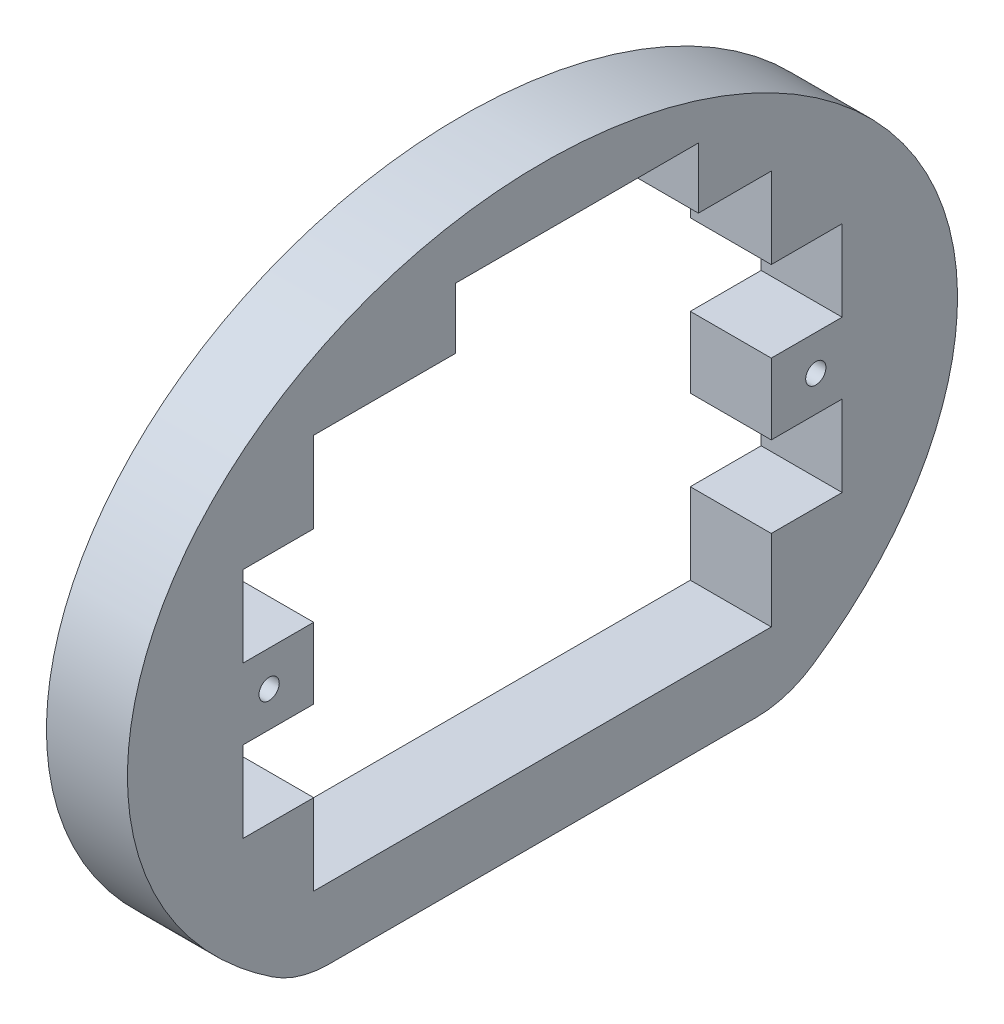
ISO-10303-21;
HEADER;
FILE_DESCRIPTION(('STEP AP214'),'2;1');
FILE_NAME('part.step','',(''),(''),'','','');
FILE_SCHEMA(('AUTOMOTIVE_DESIGN { 1 0 10303 214 1 1 1 1 }'));
ENDSEC;
DATA;
#1=APPLICATION_CONTEXT('core data for automotive mechanical design processes');
#2=APPLICATION_PROTOCOL_DEFINITION('international standard','automotive_design',2000,#1);
#3=PRODUCT_CONTEXT('',#1,'mechanical');
#4=PRODUCT('Part','Part','',(#3));
#5=PRODUCT_RELATED_PRODUCT_CATEGORY('part','',(#4));
#6=PRODUCT_DEFINITION_FORMATION('','',#4);
#7=PRODUCT_DEFINITION_CONTEXT('part definition',#1,'design');
#8=PRODUCT_DEFINITION('design','',#6,#7);
#9=PRODUCT_DEFINITION_SHAPE('','',#8);
#10=(LENGTH_UNIT() NAMED_UNIT(*) SI_UNIT(.MILLI.,.METRE.));
#11=(NAMED_UNIT(*) PLANE_ANGLE_UNIT() SI_UNIT($,.RADIAN.));
#12=(NAMED_UNIT(*) SI_UNIT($,.STERADIAN.) SOLID_ANGLE_UNIT());
#13=UNCERTAINTY_MEASURE_WITH_UNIT(LENGTH_MEASURE(1.E-05),#10,'distance_accuracy_value','');
#14=(GEOMETRIC_REPRESENTATION_CONTEXT(3) GLOBAL_UNCERTAINTY_ASSIGNED_CONTEXT((#13)) GLOBAL_UNIT_ASSIGNED_CONTEXT((#10,
#11,#12)) REPRESENTATION_CONTEXT('',''));
#15=CARTESIAN_POINT('',(0.,0.,0.));
#16=DIRECTION('',(0.,0.,1.));
#17=DIRECTION('',(1.,0.,0.));
#18=AXIS2_PLACEMENT_3D('',#15,#16,#17);
#19=CARTESIAN_POINT('',(4.,-3.50000000000002,0.));
#20=DIRECTION('',(0.,1.,0.));
#21=DIRECTION('',(0.,0.,1.));
#22=AXIS2_PLACEMENT_3D('',#19,#20,#21);
#23=PLANE('',#22);
#24=DIRECTION('',(0.,0.,-1.));
#25=VECTOR('',#24,1.);
#26=CARTESIAN_POINT('',(0.,-3.50000000000002,0.));
#27=LINE('',#26,#25);
#28=CARTESIAN_POINT('',(0.,-3.50000000000002,-0.7504563663472));
#29=VERTEX_POINT('',#28);
#30=CARTESIAN_POINT('',(0.,-3.50000000000002,-21.8495436336528));
#31=VERTEX_POINT('',#30);
#32=EDGE_CURVE('E467',#29,#31,#27,.T.);
#33=ORIENTED_EDGE('',*,*,#32,.T.);
#34=DIRECTION('',(-1.,0.,0.));
#35=VECTOR('',#34,1.);
#36=CARTESIAN_POINT('',(4.,-3.50000000000002,-21.8495436336528));
#37=LINE('',#36,#35);
#38=CARTESIAN_POINT('',(4.,-3.50000000000002,-21.8495436336528));
#39=VERTEX_POINT('',#38);
#40=EDGE_CURVE('E53',#31,#39,#37,.F.);
#41=ORIENTED_EDGE('',*,*,#40,.T.);
#42=DIRECTION('',(0.,0.,-1.));
#43=VECTOR('',#42,1.);
#44=CARTESIAN_POINT('',(4.,-3.50000000000002,0.));
#45=LINE('',#44,#43);
#46=CARTESIAN_POINT('',(4.,-3.50000000000002,-0.7504563663472));
#47=VERTEX_POINT('',#46);
#48=EDGE_CURVE('E321',#47,#39,#45,.T.);
#49=ORIENTED_EDGE('',*,*,#48,.F.);
#50=DIRECTION('',(-1.,0.,0.));
#51=VECTOR('',#50,1.);
#52=CARTESIAN_POINT('',(4.,-3.50000000000002,-0.7504563663472));
#53=LINE('',#52,#51);
#54=EDGE_CURVE('E462',#47,#29,#53,.T.);
#55=ORIENTED_EDGE('',*,*,#54,.T.);
#56=EDGE_LOOP('',(#33,#41,#49,#55));
#57=FACE_BOUND('',#56,.T.);
#58=ADVANCED_FACE('F38',(#57),#23,.F.);
#59=CARTESIAN_POINT('',(4.,15.5,0.));
#60=DIRECTION('',(0.,-1.,0.));
#61=DIRECTION('',(0.,0.,-1.));
#62=AXIS2_PLACEMENT_3D('',#59,#60,#61);
#63=PLANE('',#62);
#64=DIRECTION('',(0.,0.,1.));
#65=VECTOR('',#64,1.);
#66=CARTESIAN_POINT('',(0.,15.5,0.));
#67=LINE('',#66,#65);
#68=CARTESIAN_POINT('',(0.,15.5,0.));
#69=VERTEX_POINT('',#68);
#70=CARTESIAN_POINT('',(0.,15.5,3.5));
#71=VERTEX_POINT('',#70);
#72=EDGE_CURVE('E229',#69,#71,#67,.T.);
#73=ORIENTED_EDGE('',*,*,#72,.F.);
#74=DIRECTION('',(-1.,0.,0.));
#75=VECTOR('',#74,1.);
#76=CARTESIAN_POINT('',(4.,15.5,0.));
#77=LINE('',#76,#75);
#78=CARTESIAN_POINT('',(4.,15.5,0.));
#79=VERTEX_POINT('',#78);
#80=EDGE_CURVE('E223',#79,#69,#77,.T.);
#81=ORIENTED_EDGE('',*,*,#80,.F.);
#82=DIRECTION('',(0.,0.,1.));
#83=VECTOR('',#82,1.);
#84=CARTESIAN_POINT('',(4.,15.5,0.));
#85=LINE('',#84,#83);
#86=CARTESIAN_POINT('',(4.,15.5,3.5));
#87=VERTEX_POINT('',#86);
#88=EDGE_CURVE('E226',#79,#87,#85,.T.);
#89=ORIENTED_EDGE('',*,*,#88,.T.);
#90=DIRECTION('',(-1.,0.,0.));
#91=VECTOR('',#90,1.);
#92=CARTESIAN_POINT('',(4.,15.5,3.5));
#93=LINE('',#92,#91);
#94=EDGE_CURVE('E326',#87,#71,#93,.T.);
#95=ORIENTED_EDGE('',*,*,#94,.T.);
#96=EDGE_LOOP('',(#73,#81,#89,#95));
#97=FACE_BOUND('',#96,.T.);
#98=ADVANCED_FACE('F225',(#97),#63,.T.);
#99=CARTESIAN_POINT('',(4.,0.,0.));
#100=DIRECTION('',(0.,0.,-1.));
#101=DIRECTION('',(-1.,0.,0.));
#102=AXIS2_PLACEMENT_3D('',#99,#100,#101);
#103=PLANE('',#102);
#104=DIRECTION('',(0.,-1.,0.));
#105=VECTOR('',#104,1.);
#106=CARTESIAN_POINT('',(0.,0.,0.));
#107=LINE('',#106,#105);
#108=CARTESIAN_POINT('',(0.,19.5,0.));
#109=VERTEX_POINT('',#108);
#110=EDGE_CURVE('E523',#109,#69,#107,.T.);
#111=ORIENTED_EDGE('',*,*,#110,.F.);
#112=DIRECTION('',(-1.,0.,0.));
#113=VECTOR('',#112,1.);
#114=CARTESIAN_POINT('',(4.,19.5,0.));
#115=LINE('',#114,#113);
#116=CARTESIAN_POINT('',(4.,19.5,0.));
#117=VERTEX_POINT('',#116);
#118=EDGE_CURVE('E235',#117,#109,#115,.T.);
#119=ORIENTED_EDGE('',*,*,#118,.F.);
#120=DIRECTION('',(0.,-1.,0.));
#121=VECTOR('',#120,1.);
#122=CARTESIAN_POINT('',(4.,0.,0.));
#123=LINE('',#122,#121);
#124=EDGE_CURVE('E242',#117,#79,#123,.T.);
#125=ORIENTED_EDGE('',*,*,#124,.T.);
#126=ORIENTED_EDGE('',*,*,#80,.T.);
#127=EDGE_LOOP('',(#111,#119,#125,#126));
#128=FACE_BOUND('',#127,.T.);
#129=ADVANCED_FACE('F249',(#128),#103,.T.);
#130=CARTESIAN_POINT('',(4.,19.5,0.));
#131=DIRECTION('',(0.,-1.,0.));
#132=DIRECTION('',(0.,0.,-1.));
#133=AXIS2_PLACEMENT_3D('',#130,#131,#132);
#134=PLANE('',#133);
#135=DIRECTION('',(0.,0.,1.));
#136=VECTOR('',#135,1.);
#137=CARTESIAN_POINT('',(0.,19.5,0.));
#138=LINE('',#137,#136);
#139=CARTESIAN_POINT('',(0.,19.5,-7.));
#140=VERTEX_POINT('',#139);
#141=EDGE_CURVE('E521',#140,#109,#138,.T.);
#142=ORIENTED_EDGE('',*,*,#141,.F.);
#143=DIRECTION('',(-1.,0.,0.));
#144=VECTOR('',#143,1.);
#145=CARTESIAN_POINT('',(4.,19.5,-7.));
#146=LINE('',#145,#144);
#147=CARTESIAN_POINT('',(4.,19.5,-7.));
#148=VERTEX_POINT('',#147);
#149=EDGE_CURVE('E518',#148,#140,#146,.T.);
#150=ORIENTED_EDGE('',*,*,#149,.F.);
#151=DIRECTION('',(0.,0.,1.));
#152=VECTOR('',#151,1.);
#153=CARTESIAN_POINT('',(4.,19.5,0.));
#154=LINE('',#153,#152);
#155=EDGE_CURVE('E250',#148,#117,#154,.T.);
#156=ORIENTED_EDGE('',*,*,#155,.T.);
#157=ORIENTED_EDGE('',*,*,#118,.T.);
#158=EDGE_LOOP('',(#142,#150,#156,#157));
#159=FACE_BOUND('',#158,.T.);
#160=ADVANCED_FACE('F429',(#159),#134,.T.);
#161=CARTESIAN_POINT('',(4.,0.,-7.));
#162=DIRECTION('',(0.,0.,-1.));
#163=DIRECTION('',(-1.,0.,0.));
#164=AXIS2_PLACEMENT_3D('',#161,#162,#163);
#165=PLANE('',#164);
#166=DIRECTION('',(0.,-1.,0.));
#167=VECTOR('',#166,1.);
#168=CARTESIAN_POINT('',(0.,0.,-7.));
#169=LINE('',#168,#167);
#170=CARTESIAN_POINT('',(0.,22.5,-7.));
#171=VERTEX_POINT('',#170);
#172=EDGE_CURVE('E527',#171,#140,#169,.T.);
#173=ORIENTED_EDGE('',*,*,#172,.F.);
#174=DIRECTION('',(-1.,0.,0.));
#175=VECTOR('',#174,1.);
#176=CARTESIAN_POINT('',(4.,22.5,-7.));
#177=LINE('',#176,#175);
#178=CARTESIAN_POINT('',(4.,22.5,-7.));
#179=VERTEX_POINT('',#178);
#180=EDGE_CURVE('E516',#179,#171,#177,.T.);
#181=ORIENTED_EDGE('',*,*,#180,.F.);
#182=DIRECTION('',(0.,-1.,0.));
#183=VECTOR('',#182,1.);
#184=CARTESIAN_POINT('',(4.,0.,-7.));
#185=LINE('',#184,#183);
#186=EDGE_CURVE('E252',#179,#148,#185,.T.);
#187=ORIENTED_EDGE('',*,*,#186,.T.);
#188=ORIENTED_EDGE('',*,*,#149,.T.);
#189=EDGE_LOOP('',(#173,#181,#187,#188));
#190=FACE_BOUND('',#189,.T.);
#191=ADVANCED_FACE('F425',(#190),#165,.T.);
#192=CARTESIAN_POINT('',(4.,22.5,0.));
#193=DIRECTION('',(0.,-1.,0.));
#194=DIRECTION('',(0.,0.,-1.));
#195=AXIS2_PLACEMENT_3D('',#192,#193,#194);
#196=PLANE('',#195);
#197=DIRECTION('',(0.,0.,1.));
#198=VECTOR('',#197,1.);
#199=CARTESIAN_POINT('',(0.,22.5,0.));
#200=LINE('',#199,#198);
#201=CARTESIAN_POINT('',(0.,22.5,-19.));
#202=VERTEX_POINT('',#201);
#203=EDGE_CURVE('E529',#202,#171,#200,.T.);
#204=ORIENTED_EDGE('',*,*,#203,.F.);
#205=DIRECTION('',(-1.,0.,0.));
#206=VECTOR('',#205,1.);
#207=CARTESIAN_POINT('',(4.,22.5,-19.));
#208=LINE('',#207,#206);
#209=CARTESIAN_POINT('',(4.,22.5,-19.));
#210=VERTEX_POINT('',#209);
#211=EDGE_CURVE('E514',#210,#202,#208,.T.);
#212=ORIENTED_EDGE('',*,*,#211,.F.);
#213=DIRECTION('',(0.,0.,1.));
#214=VECTOR('',#213,1.);
#215=CARTESIAN_POINT('',(4.,22.5,0.));
#216=LINE('',#215,#214);
#217=EDGE_CURVE('E257',#210,#179,#216,.T.);
#218=ORIENTED_EDGE('',*,*,#217,.T.);
#219=ORIENTED_EDGE('',*,*,#180,.T.);
#220=EDGE_LOOP('',(#204,#212,#218,#219));
#221=FACE_BOUND('',#220,.T.);
#222=ADVANCED_FACE('F421',(#221),#196,.T.);
#223=CARTESIAN_POINT('',(4.,0.,-19.));
#224=DIRECTION('',(0.,0.,1.));
#225=DIRECTION('',(1.,0.,0.));
#226=AXIS2_PLACEMENT_3D('',#223,#224,#225);
#227=PLANE('',#226);
#228=DIRECTION('',(0.,1.,0.));
#229=VECTOR('',#228,1.);
#230=CARTESIAN_POINT('',(0.,0.,-19.));
#231=LINE('',#230,#229);
#232=CARTESIAN_POINT('',(0.,19.5,-19.));
#233=VERTEX_POINT('',#232);
#234=EDGE_CURVE('E533',#233,#202,#231,.T.);
#235=ORIENTED_EDGE('',*,*,#234,.F.);
#236=DIRECTION('',(-1.,0.,0.));
#237=VECTOR('',#236,1.);
#238=CARTESIAN_POINT('',(4.,19.5,-19.));
#239=LINE('',#238,#237);
#240=CARTESIAN_POINT('',(4.,19.5,-19.));
#241=VERTEX_POINT('',#240);
#242=EDGE_CURVE('E512',#241,#233,#239,.T.);
#243=ORIENTED_EDGE('',*,*,#242,.F.);
#244=DIRECTION('',(0.,1.,0.));
#245=VECTOR('',#244,1.);
#246=CARTESIAN_POINT('',(4.,0.,-19.));
#247=LINE('',#246,#245);
#248=EDGE_CURVE('E260',#241,#210,#247,.T.);
#249=ORIENTED_EDGE('',*,*,#248,.T.);
#250=ORIENTED_EDGE('',*,*,#211,.T.);
#251=EDGE_LOOP('',(#235,#243,#249,#250));
#252=FACE_BOUND('',#251,.T.);
#253=ADVANCED_FACE('F417',(#252),#227,.T.);
#254=CARTESIAN_POINT('',(4.,19.5,0.));
#255=DIRECTION('',(0.,-1.,0.));
#256=DIRECTION('',(0.,0.,-1.));
#257=AXIS2_PLACEMENT_3D('',#254,#255,#256);
#258=PLANE('',#257);
#259=DIRECTION('',(0.,0.,1.));
#260=VECTOR('',#259,1.);
#261=CARTESIAN_POINT('',(0.,19.5,0.));
#262=LINE('',#261,#260);
#263=CARTESIAN_POINT('',(0.,19.5,-22.6));
#264=VERTEX_POINT('',#263);
#265=EDGE_CURVE('E536',#264,#233,#262,.T.);
#266=ORIENTED_EDGE('',*,*,#265,.F.);
#267=DIRECTION('',(-1.,0.,0.));
#268=VECTOR('',#267,1.);
#269=CARTESIAN_POINT('',(4.,19.5,-22.6));
#270=LINE('',#269,#268);
#271=CARTESIAN_POINT('',(4.,19.5,-22.6));
#272=VERTEX_POINT('',#271);
#273=EDGE_CURVE('E510',#272,#264,#270,.T.);
#274=ORIENTED_EDGE('',*,*,#273,.F.);
#275=DIRECTION('',(0.,0.,1.));
#276=VECTOR('',#275,1.);
#277=CARTESIAN_POINT('',(4.,19.5,0.));
#278=LINE('',#277,#276);
#279=EDGE_CURVE('E263',#272,#241,#278,.T.);
#280=ORIENTED_EDGE('',*,*,#279,.T.);
#281=ORIENTED_EDGE('',*,*,#242,.T.);
#282=EDGE_LOOP('',(#266,#274,#280,#281));
#283=FACE_BOUND('',#282,.T.);
#284=ADVANCED_FACE('F413',(#283),#258,.T.);
#285=CARTESIAN_POINT('',(4.,0.,-22.6));
#286=DIRECTION('',(0.,0.,1.));
#287=DIRECTION('',(1.,0.,0.));
#288=AXIS2_PLACEMENT_3D('',#285,#286,#287);
#289=PLANE('',#288);
#290=DIRECTION('',(0.,1.,0.));
#291=VECTOR('',#290,1.);
#292=CARTESIAN_POINT('',(0.,0.,-22.6));
#293=LINE('',#292,#291);
#294=CARTESIAN_POINT('',(0.,15.5,-22.6));
#295=VERTEX_POINT('',#294);
#296=EDGE_CURVE('E539',#295,#264,#293,.T.);
#297=ORIENTED_EDGE('',*,*,#296,.F.);
#298=DIRECTION('',(-1.,0.,0.));
#299=VECTOR('',#298,1.);
#300=CARTESIAN_POINT('',(4.,15.5,-22.6));
#301=LINE('',#300,#299);
#302=CARTESIAN_POINT('',(4.,15.5,-22.6));
#303=VERTEX_POINT('',#302);
#304=EDGE_CURVE('E508',#303,#295,#301,.T.);
#305=ORIENTED_EDGE('',*,*,#304,.F.);
#306=DIRECTION('',(0.,1.,0.));
#307=VECTOR('',#306,1.);
#308=CARTESIAN_POINT('',(4.,0.,-22.6));
#309=LINE('',#308,#307);
#310=EDGE_CURVE('E266',#303,#272,#309,.T.);
#311=ORIENTED_EDGE('',*,*,#310,.T.);
#312=ORIENTED_EDGE('',*,*,#273,.T.);
#313=EDGE_LOOP('',(#297,#305,#311,#312));
#314=FACE_BOUND('',#313,.T.);
#315=ADVANCED_FACE('F409',(#314),#289,.T.);
#316=CARTESIAN_POINT('',(4.,15.5,0.));
#317=DIRECTION('',(0.,-1.,0.));
#318=DIRECTION('',(0.,0.,-1.));
#319=AXIS2_PLACEMENT_3D('',#316,#317,#318);
#320=PLANE('',#319);
#321=DIRECTION('',(0.,0.,1.));
#322=VECTOR('',#321,1.);
#323=CARTESIAN_POINT('',(0.,15.5,0.));
#324=LINE('',#323,#322);
#325=CARTESIAN_POINT('',(0.,15.5,-26.1));
#326=VERTEX_POINT('',#325);
#327=EDGE_CURVE('E542',#326,#295,#324,.T.);
#328=ORIENTED_EDGE('',*,*,#327,.F.);
#329=DIRECTION('',(-1.,0.,0.));
#330=VECTOR('',#329,1.);
#331=CARTESIAN_POINT('',(4.,15.5,-26.1));
#332=LINE('',#331,#330);
#333=CARTESIAN_POINT('',(4.,15.5,-26.1));
#334=VERTEX_POINT('',#333);
#335=EDGE_CURVE('E506',#334,#326,#332,.T.);
#336=ORIENTED_EDGE('',*,*,#335,.F.);
#337=DIRECTION('',(0.,0.,1.));
#338=VECTOR('',#337,1.);
#339=CARTESIAN_POINT('',(4.,15.5,0.));
#340=LINE('',#339,#338);
#341=EDGE_CURVE('E269',#334,#303,#340,.T.);
#342=ORIENTED_EDGE('',*,*,#341,.T.);
#343=ORIENTED_EDGE('',*,*,#304,.T.);
#344=EDGE_LOOP('',(#328,#336,#342,#343));
#345=FACE_BOUND('',#344,.T.);
#346=ADVANCED_FACE('F405',(#345),#320,.T.);
#347=CARTESIAN_POINT('',(4.,0.,-26.1));
#348=DIRECTION('',(0.,0.,1.));
#349=DIRECTION('',(1.,0.,0.));
#350=AXIS2_PLACEMENT_3D('',#347,#348,#349);
#351=PLANE('',#350);
#352=DIRECTION('',(0.,1.,0.));
#353=VECTOR('',#352,1.);
#354=CARTESIAN_POINT('',(0.,0.,-26.1));
#355=LINE('',#354,#353);
#356=CARTESIAN_POINT('',(0.,11.5,-26.1));
#357=VERTEX_POINT('',#356);
#358=EDGE_CURVE('E545',#357,#326,#355,.T.);
#359=ORIENTED_EDGE('',*,*,#358,.F.);
#360=DIRECTION('',(-1.,0.,0.));
#361=VECTOR('',#360,1.);
#362=CARTESIAN_POINT('',(4.,11.5,-26.1));
#363=LINE('',#362,#361);
#364=CARTESIAN_POINT('',(4.,11.5,-26.1));
#365=VERTEX_POINT('',#364);
#366=EDGE_CURVE('E504',#365,#357,#363,.T.);
#367=ORIENTED_EDGE('',*,*,#366,.F.);
#368=DIRECTION('',(0.,1.,0.));
#369=VECTOR('',#368,1.);
#370=CARTESIAN_POINT('',(4.,0.,-26.1));
#371=LINE('',#370,#369);
#372=EDGE_CURVE('E272',#365,#334,#371,.T.);
#373=ORIENTED_EDGE('',*,*,#372,.T.);
#374=ORIENTED_EDGE('',*,*,#335,.T.);
#375=EDGE_LOOP('',(#359,#367,#373,#374));
#376=FACE_BOUND('',#375,.T.);
#377=ADVANCED_FACE('F401',(#376),#351,.T.);
#378=CARTESIAN_POINT('',(4.,11.5,0.));
#379=DIRECTION('',(0.,1.,0.));
#380=DIRECTION('',(0.,0.,1.));
#381=AXIS2_PLACEMENT_3D('',#378,#379,#380);
#382=PLANE('',#381);
#383=DIRECTION('',(0.,0.,-1.));
#384=VECTOR('',#383,1.);
#385=CARTESIAN_POINT('',(0.,11.5,0.));
#386=LINE('',#385,#384);
#387=CARTESIAN_POINT('',(0.,11.5,-22.6));
#388=VERTEX_POINT('',#387);
#389=EDGE_CURVE('E548',#388,#357,#386,.T.);
#390=ORIENTED_EDGE('',*,*,#389,.F.);
#391=DIRECTION('',(-1.,0.,0.));
#392=VECTOR('',#391,1.);
#393=CARTESIAN_POINT('',(4.,11.5,-22.6));
#394=LINE('',#393,#392);
#395=CARTESIAN_POINT('',(4.,11.5,-22.6));
#396=VERTEX_POINT('',#395);
#397=EDGE_CURVE('E502',#396,#388,#394,.T.);
#398=ORIENTED_EDGE('',*,*,#397,.F.);
#399=DIRECTION('',(0.,0.,-1.));
#400=VECTOR('',#399,1.);
#401=CARTESIAN_POINT('',(4.,11.5,0.));
#402=LINE('',#401,#400);
#403=EDGE_CURVE('E275',#396,#365,#402,.T.);
#404=ORIENTED_EDGE('',*,*,#403,.T.);
#405=ORIENTED_EDGE('',*,*,#366,.T.);
#406=EDGE_LOOP('',(#390,#398,#404,#405));
#407=FACE_BOUND('',#406,.T.);
#408=ADVANCED_FACE('F397',(#407),#382,.T.);
#409=CARTESIAN_POINT('',(4.,0.,-22.6));
#410=DIRECTION('',(0.,0.,1.));
#411=DIRECTION('',(1.,0.,0.));
#412=AXIS2_PLACEMENT_3D('',#409,#410,#411);
#413=PLANE('',#412);
#414=DIRECTION('',(0.,1.,0.));
#415=VECTOR('',#414,1.);
#416=CARTESIAN_POINT('',(0.,0.,-22.6));
#417=LINE('',#416,#415);
#418=CARTESIAN_POINT('',(0.,8.,-22.6));
#419=VERTEX_POINT('',#418);
#420=EDGE_CURVE('E551',#419,#388,#417,.T.);
#421=ORIENTED_EDGE('',*,*,#420,.F.);
#422=DIRECTION('',(-1.,0.,0.));
#423=VECTOR('',#422,1.);
#424=CARTESIAN_POINT('',(4.,8.,-22.6));
#425=LINE('',#424,#423);
#426=CARTESIAN_POINT('',(4.,8.,-22.6));
#427=VERTEX_POINT('',#426);
#428=EDGE_CURVE('E500',#427,#419,#425,.T.);
#429=ORIENTED_EDGE('',*,*,#428,.F.);
#430=DIRECTION('',(0.,1.,0.));
#431=VECTOR('',#430,1.);
#432=CARTESIAN_POINT('',(4.,0.,-22.6));
#433=LINE('',#432,#431);
#434=EDGE_CURVE('E278',#427,#396,#433,.T.);
#435=ORIENTED_EDGE('',*,*,#434,.T.);
#436=ORIENTED_EDGE('',*,*,#397,.T.);
#437=EDGE_LOOP('',(#421,#429,#435,#436));
#438=FACE_BOUND('',#437,.T.);
#439=ADVANCED_FACE('F393',(#438),#413,.T.);
#440=CARTESIAN_POINT('',(4.,7.99999999999998,0.));
#441=DIRECTION('',(0.,-1.,0.));
#442=DIRECTION('',(0.,0.,-1.));
#443=AXIS2_PLACEMENT_3D('',#440,#441,#442);
#444=PLANE('',#443);
#445=DIRECTION('',(0.,0.,1.));
#446=VECTOR('',#445,1.);
#447=CARTESIAN_POINT('',(0.,7.99999999999998,0.));
#448=LINE('',#447,#446);
#449=CARTESIAN_POINT('',(0.,8.,-26.1));
#450=VERTEX_POINT('',#449);
#451=EDGE_CURVE('E554',#450,#419,#448,.T.);
#452=ORIENTED_EDGE('',*,*,#451,.F.);
#453=DIRECTION('',(-1.,0.,0.));
#454=VECTOR('',#453,1.);
#455=CARTESIAN_POINT('',(4.,8.,-26.1));
#456=LINE('',#455,#454);
#457=CARTESIAN_POINT('',(4.,8.,-26.1));
#458=VERTEX_POINT('',#457);
#459=EDGE_CURVE('E498',#458,#450,#456,.T.);
#460=ORIENTED_EDGE('',*,*,#459,.F.);
#461=DIRECTION('',(0.,0.,1.));
#462=VECTOR('',#461,1.);
#463=CARTESIAN_POINT('',(4.,7.99999999999998,0.));
#464=LINE('',#463,#462);
#465=EDGE_CURVE('E281',#458,#427,#464,.T.);
#466=ORIENTED_EDGE('',*,*,#465,.T.);
#467=ORIENTED_EDGE('',*,*,#428,.T.);
#468=EDGE_LOOP('',(#452,#460,#466,#467));
#469=FACE_BOUND('',#468,.T.);
#470=ADVANCED_FACE('F389',(#469),#444,.T.);
#471=CARTESIAN_POINT('',(4.,0.,-26.1));
#472=DIRECTION('',(0.,0.,1.));
#473=DIRECTION('',(1.,0.,0.));
#474=AXIS2_PLACEMENT_3D('',#471,#472,#473);
#475=PLANE('',#474);
#476=DIRECTION('',(0.,1.,0.));
#477=VECTOR('',#476,1.);
#478=CARTESIAN_POINT('',(0.,0.,-26.1));
#479=LINE('',#478,#477);
#480=CARTESIAN_POINT('',(0.,4.,-26.1));
#481=VERTEX_POINT('',#480);
#482=EDGE_CURVE('E557',#481,#450,#479,.T.);
#483=ORIENTED_EDGE('',*,*,#482,.F.);
#484=DIRECTION('',(-1.,0.,0.));
#485=VECTOR('',#484,1.);
#486=CARTESIAN_POINT('',(4.,4.,-26.1));
#487=LINE('',#486,#485);
#488=CARTESIAN_POINT('',(4.,4.,-26.1));
#489=VERTEX_POINT('',#488);
#490=EDGE_CURVE('E496',#489,#481,#487,.T.);
#491=ORIENTED_EDGE('',*,*,#490,.F.);
#492=DIRECTION('',(0.,1.,0.));
#493=VECTOR('',#492,1.);
#494=CARTESIAN_POINT('',(4.,0.,-26.1));
#495=LINE('',#494,#493);
#496=EDGE_CURVE('E284',#489,#458,#495,.T.);
#497=ORIENTED_EDGE('',*,*,#496,.T.);
#498=ORIENTED_EDGE('',*,*,#459,.T.);
#499=EDGE_LOOP('',(#483,#491,#497,#498));
#500=FACE_BOUND('',#499,.T.);
#501=ADVANCED_FACE('F385',(#500),#475,.T.);
#502=CARTESIAN_POINT('',(4.,4.,0.));
#503=DIRECTION('',(0.,1.,0.));
#504=DIRECTION('',(0.,0.,1.));
#505=AXIS2_PLACEMENT_3D('',#502,#503,#504);
#506=PLANE('',#505);
#507=DIRECTION('',(0.,0.,-1.));
#508=VECTOR('',#507,1.);
#509=CARTESIAN_POINT('',(0.,4.,0.));
#510=LINE('',#509,#508);
#511=CARTESIAN_POINT('',(0.,4.,-22.6));
#512=VERTEX_POINT('',#511);
#513=EDGE_CURVE('E560',#512,#481,#510,.T.);
#514=ORIENTED_EDGE('',*,*,#513,.F.);
#515=DIRECTION('',(-1.,0.,0.));
#516=VECTOR('',#515,1.);
#517=CARTESIAN_POINT('',(4.,4.,-22.6));
#518=LINE('',#517,#516);
#519=CARTESIAN_POINT('',(4.,4.,-22.6));
#520=VERTEX_POINT('',#519);
#521=EDGE_CURVE('E494',#520,#512,#518,.T.);
#522=ORIENTED_EDGE('',*,*,#521,.F.);
#523=DIRECTION('',(0.,0.,-1.));
#524=VECTOR('',#523,1.);
#525=CARTESIAN_POINT('',(4.,4.,0.));
#526=LINE('',#525,#524);
#527=EDGE_CURVE('E287',#520,#489,#526,.T.);
#528=ORIENTED_EDGE('',*,*,#527,.T.);
#529=ORIENTED_EDGE('',*,*,#490,.T.);
#530=EDGE_LOOP('',(#514,#522,#528,#529));
#531=FACE_BOUND('',#530,.T.);
#532=ADVANCED_FACE('F381',(#531),#506,.T.);
#533=CARTESIAN_POINT('',(4.,0.,-22.6));
#534=DIRECTION('',(0.,0.,1.));
#535=DIRECTION('',(1.,0.,0.));
#536=AXIS2_PLACEMENT_3D('',#533,#534,#535);
#537=PLANE('',#536);
#538=DIRECTION('',(0.,1.,0.));
#539=VECTOR('',#538,1.);
#540=CARTESIAN_POINT('',(0.,0.,-22.6));
#541=LINE('',#540,#539);
#542=CARTESIAN_POINT('',(0.,0.,-22.6));
#543=VERTEX_POINT('',#542);
#544=EDGE_CURVE('E563',#543,#512,#541,.T.);
#545=ORIENTED_EDGE('',*,*,#544,.F.);
#546=DIRECTION('',(-1.,0.,0.));
#547=VECTOR('',#546,1.);
#548=CARTESIAN_POINT('',(4.,0.,-22.6));
#549=LINE('',#548,#547);
#550=CARTESIAN_POINT('',(4.,0.,-22.6));
#551=VERTEX_POINT('',#550);
#552=EDGE_CURVE('E492',#551,#543,#549,.T.);
#553=ORIENTED_EDGE('',*,*,#552,.F.);
#554=DIRECTION('',(0.,1.,0.));
#555=VECTOR('',#554,1.);
#556=CARTESIAN_POINT('',(4.,0.,-22.6));
#557=LINE('',#556,#555);
#558=EDGE_CURVE('E290',#551,#520,#557,.T.);
#559=ORIENTED_EDGE('',*,*,#558,.T.);
#560=ORIENTED_EDGE('',*,*,#521,.T.);
#561=EDGE_LOOP('',(#545,#553,#559,#560));
#562=FACE_BOUND('',#561,.T.);
#563=ADVANCED_FACE('F377',(#562),#537,.T.);
#564=CARTESIAN_POINT('',(4.,0.,0.));
#565=DIRECTION('',(0.,1.,0.));
#566=DIRECTION('',(0.,0.,1.));
#567=AXIS2_PLACEMENT_3D('',#564,#565,#566);
#568=PLANE('',#567);
#569=DIRECTION('',(0.,0.,-1.));
#570=VECTOR('',#569,1.);
#571=CARTESIAN_POINT('',(0.,0.,0.));
#572=LINE('',#571,#570);
#573=CARTESIAN_POINT('',(0.,0.,0.));
#574=VERTEX_POINT('',#573);
#575=EDGE_CURVE('E566',#574,#543,#572,.T.);
#576=ORIENTED_EDGE('',*,*,#575,.F.);
#577=DIRECTION('',(-1.,0.,0.));
#578=VECTOR('',#577,1.);
#579=CARTESIAN_POINT('',(4.,0.,0.));
#580=LINE('',#579,#578);
#581=CARTESIAN_POINT('',(4.,0.,0.));
#582=VERTEX_POINT('',#581);
#583=EDGE_CURVE('E490',#582,#574,#580,.T.);
#584=ORIENTED_EDGE('',*,*,#583,.F.);
#585=DIRECTION('',(0.,0.,-1.));
#586=VECTOR('',#585,1.);
#587=CARTESIAN_POINT('',(4.,0.,0.));
#588=LINE('',#587,#586);
#589=EDGE_CURVE('E293',#582,#551,#588,.T.);
#590=ORIENTED_EDGE('',*,*,#589,.T.);
#591=ORIENTED_EDGE('',*,*,#552,.T.);
#592=EDGE_LOOP('',(#576,#584,#590,#591));
#593=FACE_BOUND('',#592,.T.);
#594=ADVANCED_FACE('F373',(#593),#568,.T.);
#595=CARTESIAN_POINT('',(4.,0.,0.));
#596=DIRECTION('',(0.,0.,-1.));
#597=DIRECTION('',(-1.,0.,0.));
#598=AXIS2_PLACEMENT_3D('',#595,#596,#597);
#599=PLANE('',#598);
#600=DIRECTION('',(0.,-1.,0.));
#601=VECTOR('',#600,1.);
#602=CARTESIAN_POINT('',(0.,0.,0.));
#603=LINE('',#602,#601);
#604=CARTESIAN_POINT('',(0.,4.,0.));
#605=VERTEX_POINT('',#604);
#606=EDGE_CURVE('E569',#605,#574,#603,.T.);
#607=ORIENTED_EDGE('',*,*,#606,.F.);
#608=DIRECTION('',(-1.,0.,0.));
#609=VECTOR('',#608,1.);
#610=CARTESIAN_POINT('',(4.,4.,0.));
#611=LINE('',#610,#609);
#612=CARTESIAN_POINT('',(4.,4.,0.));
#613=VERTEX_POINT('',#612);
#614=EDGE_CURVE('E488',#613,#605,#611,.T.);
#615=ORIENTED_EDGE('',*,*,#614,.F.);
#616=DIRECTION('',(0.,-1.,0.));
#617=VECTOR('',#616,1.);
#618=CARTESIAN_POINT('',(4.,0.,0.));
#619=LINE('',#618,#617);
#620=EDGE_CURVE('E296',#613,#582,#619,.T.);
#621=ORIENTED_EDGE('',*,*,#620,.T.);
#622=ORIENTED_EDGE('',*,*,#583,.T.);
#623=EDGE_LOOP('',(#607,#615,#621,#622));
#624=FACE_BOUND('',#623,.T.);
#625=ADVANCED_FACE('F369',(#624),#599,.T.);
#626=CARTESIAN_POINT('',(4.,4.,0.));
#627=DIRECTION('',(0.,1.,0.));
#628=DIRECTION('',(0.,0.,1.));
#629=AXIS2_PLACEMENT_3D('',#626,#627,#628);
#630=PLANE('',#629);
#631=DIRECTION('',(0.,0.,-1.));
#632=VECTOR('',#631,1.);
#633=CARTESIAN_POINT('',(0.,4.,0.));
#634=LINE('',#633,#632);
#635=CARTESIAN_POINT('',(0.,4.,3.5));
#636=VERTEX_POINT('',#635);
#637=EDGE_CURVE('E572',#636,#605,#634,.T.);
#638=ORIENTED_EDGE('',*,*,#637,.F.);
#639=DIRECTION('',(-1.,0.,0.));
#640=VECTOR('',#639,1.);
#641=CARTESIAN_POINT('',(4.,4.,3.5));
#642=LINE('',#641,#640);
#643=CARTESIAN_POINT('',(4.,4.,3.5));
#644=VERTEX_POINT('',#643);
#645=EDGE_CURVE('E486',#644,#636,#642,.T.);
#646=ORIENTED_EDGE('',*,*,#645,.F.);
#647=DIRECTION('',(0.,0.,-1.));
#648=VECTOR('',#647,1.);
#649=CARTESIAN_POINT('',(4.,4.,0.));
#650=LINE('',#649,#648);
#651=EDGE_CURVE('E299',#644,#613,#650,.T.);
#652=ORIENTED_EDGE('',*,*,#651,.T.);
#653=ORIENTED_EDGE('',*,*,#614,.T.);
#654=EDGE_LOOP('',(#638,#646,#652,#653));
#655=FACE_BOUND('',#654,.T.);
#656=ADVANCED_FACE('F365',(#655),#630,.T.);
#657=CARTESIAN_POINT('',(4.,0.,3.5));
#658=DIRECTION('',(0.,0.,-1.));
#659=DIRECTION('',(-1.,0.,0.));
#660=AXIS2_PLACEMENT_3D('',#657,#658,#659);
#661=PLANE('',#660);
#662=DIRECTION('',(0.,-1.,0.));
#663=VECTOR('',#662,1.);
#664=CARTESIAN_POINT('',(0.,0.,3.5));
#665=LINE('',#664,#663);
#666=CARTESIAN_POINT('',(0.,8.,3.5));
#667=VERTEX_POINT('',#666);
#668=EDGE_CURVE('E575',#667,#636,#665,.T.);
#669=ORIENTED_EDGE('',*,*,#668,.F.);
#670=DIRECTION('',(-1.,0.,0.));
#671=VECTOR('',#670,1.);
#672=CARTESIAN_POINT('',(4.,8.,3.5));
#673=LINE('',#672,#671);
#674=CARTESIAN_POINT('',(4.,8.,3.5));
#675=VERTEX_POINT('',#674);
#676=EDGE_CURVE('E484',#675,#667,#673,.T.);
#677=ORIENTED_EDGE('',*,*,#676,.F.);
#678=DIRECTION('',(0.,-1.,0.));
#679=VECTOR('',#678,1.);
#680=CARTESIAN_POINT('',(4.,0.,3.5));
#681=LINE('',#680,#679);
#682=EDGE_CURVE('E302',#675,#644,#681,.T.);
#683=ORIENTED_EDGE('',*,*,#682,.T.);
#684=ORIENTED_EDGE('',*,*,#645,.T.);
#685=EDGE_LOOP('',(#669,#677,#683,#684));
#686=FACE_BOUND('',#685,.T.);
#687=ADVANCED_FACE('F361',(#686),#661,.T.);
#688=CARTESIAN_POINT('',(4.,8.,0.));
#689=DIRECTION('',(0.,-1.,0.));
#690=DIRECTION('',(0.,0.,-1.));
#691=AXIS2_PLACEMENT_3D('',#688,#689,#690);
#692=PLANE('',#691);
#693=DIRECTION('',(0.,0.,1.));
#694=VECTOR('',#693,1.);
#695=CARTESIAN_POINT('',(0.,8.,0.));
#696=LINE('',#695,#694);
#697=CARTESIAN_POINT('',(0.,8.,0.));
#698=VERTEX_POINT('',#697);
#699=EDGE_CURVE('E578',#698,#667,#696,.T.);
#700=ORIENTED_EDGE('',*,*,#699,.F.);
#701=DIRECTION('',(-1.,0.,0.));
#702=VECTOR('',#701,1.);
#703=CARTESIAN_POINT('',(4.,8.,0.));
#704=LINE('',#703,#702);
#705=CARTESIAN_POINT('',(4.,8.,0.));
#706=VERTEX_POINT('',#705);
#707=EDGE_CURVE('E482',#706,#698,#704,.T.);
#708=ORIENTED_EDGE('',*,*,#707,.F.);
#709=DIRECTION('',(0.,0.,1.));
#710=VECTOR('',#709,1.);
#711=CARTESIAN_POINT('',(4.,8.,0.));
#712=LINE('',#711,#710);
#713=EDGE_CURVE('E305',#706,#675,#712,.T.);
#714=ORIENTED_EDGE('',*,*,#713,.T.);
#715=ORIENTED_EDGE('',*,*,#676,.T.);
#716=EDGE_LOOP('',(#700,#708,#714,#715));
#717=FACE_BOUND('',#716,.T.);
#718=ADVANCED_FACE('F357',(#717),#692,.T.);
#719=CARTESIAN_POINT('',(4.,0.,0.));
#720=DIRECTION('',(0.,0.,-1.));
#721=DIRECTION('',(-1.,0.,0.));
#722=AXIS2_PLACEMENT_3D('',#719,#720,#721);
#723=PLANE('',#722);
#724=DIRECTION('',(0.,-1.,0.));
#725=VECTOR('',#724,1.);
#726=CARTESIAN_POINT('',(0.,0.,0.));
#727=LINE('',#726,#725);
#728=CARTESIAN_POINT('',(0.,11.5,0.));
#729=VERTEX_POINT('',#728);
#730=EDGE_CURVE('E581',#729,#698,#727,.T.);
#731=ORIENTED_EDGE('',*,*,#730,.F.);
#732=DIRECTION('',(-1.,0.,0.));
#733=VECTOR('',#732,1.);
#734=CARTESIAN_POINT('',(4.,11.5,0.));
#735=LINE('',#734,#733);
#736=CARTESIAN_POINT('',(4.,11.5,0.));
#737=VERTEX_POINT('',#736);
#738=EDGE_CURVE('E480',#737,#729,#735,.T.);
#739=ORIENTED_EDGE('',*,*,#738,.F.);
#740=DIRECTION('',(0.,-1.,0.));
#741=VECTOR('',#740,1.);
#742=CARTESIAN_POINT('',(4.,0.,0.));
#743=LINE('',#742,#741);
#744=EDGE_CURVE('E308',#737,#706,#743,.T.);
#745=ORIENTED_EDGE('',*,*,#744,.T.);
#746=ORIENTED_EDGE('',*,*,#707,.T.);
#747=EDGE_LOOP('',(#731,#739,#745,#746));
#748=FACE_BOUND('',#747,.T.);
#749=ADVANCED_FACE('F353',(#748),#723,.T.);
#750=CARTESIAN_POINT('',(4.,11.5,0.));
#751=DIRECTION('',(0.,1.,0.));
#752=DIRECTION('',(0.,0.,1.));
#753=AXIS2_PLACEMENT_3D('',#750,#751,#752);
#754=PLANE('',#753);
#755=DIRECTION('',(0.,0.,-1.));
#756=VECTOR('',#755,1.);
#757=CARTESIAN_POINT('',(0.,11.5,0.));
#758=LINE('',#757,#756);
#759=CARTESIAN_POINT('',(0.,11.5,3.5));
#760=VERTEX_POINT('',#759);
#761=EDGE_CURVE('E584',#760,#729,#758,.T.);
#762=ORIENTED_EDGE('',*,*,#761,.F.);
#763=DIRECTION('',(-1.,0.,0.));
#764=VECTOR('',#763,1.);
#765=CARTESIAN_POINT('',(4.,11.5,3.5));
#766=LINE('',#765,#764);
#767=CARTESIAN_POINT('',(4.,11.5,3.5));
#768=VERTEX_POINT('',#767);
#769=EDGE_CURVE('E478',#768,#760,#766,.T.);
#770=ORIENTED_EDGE('',*,*,#769,.F.);
#771=DIRECTION('',(0.,0.,-1.));
#772=VECTOR('',#771,1.);
#773=CARTESIAN_POINT('',(4.,11.5,0.));
#774=LINE('',#773,#772);
#775=EDGE_CURVE('E311',#768,#737,#774,.T.);
#776=ORIENTED_EDGE('',*,*,#775,.T.);
#777=ORIENTED_EDGE('',*,*,#738,.T.);
#778=EDGE_LOOP('',(#762,#770,#776,#777));
#779=FACE_BOUND('',#778,.T.);
#780=ADVANCED_FACE('F343',(#779),#754,.T.);
#781=CARTESIAN_POINT('',(4.,9.75,-24.8));
#782=DIRECTION('',(-1.,0.,0.));
#783=DIRECTION('',(0.,0.,1.));
#784=AXIS2_PLACEMENT_3D('',#781,#782,#783);
#785=CYLINDRICAL_SURFACE('',#784,0.499999999999999);
#786=CARTESIAN_POINT('',(4.,9.75,-24.8));
#787=DIRECTION('',(1.,0.,0.));
#788=DIRECTION('',(0.,0.,-1.));
#789=AXIS2_PLACEMENT_3D('',#786,#787,#788);
#790=CIRCLE('',#789,0.499999999999999);
#791=CARTESIAN_POINT('',(4.,9.75,-25.3));
#792=VERTEX_POINT('',#791);
#793=EDGE_CURVE('E318',#792,#792,#790,.T.);
#794=ORIENTED_EDGE('',*,*,#793,.T.);
#795=EDGE_LOOP('',(#794));
#796=FACE_BOUND('',#795,.T.);
#797=CARTESIAN_POINT('',(0.,9.75,-24.8));
#798=DIRECTION('',(1.,0.,0.));
#799=DIRECTION('',(0.,0.,-1.));
#800=AXIS2_PLACEMENT_3D('',#797,#798,#799);
#801=CIRCLE('',#800,0.499999999999999);
#802=CARTESIAN_POINT('',(0.,9.75,-25.3));
#803=VERTEX_POINT('',#802);
#804=EDGE_CURVE('E469',#803,#803,#801,.T.);
#805=ORIENTED_EDGE('',*,*,#804,.F.);
#806=EDGE_LOOP('',(#805));
#807=FACE_BOUND('',#806,.T.);
#808=ADVANCED_FACE('F339',(#796,#807),#785,.F.);
#809=CARTESIAN_POINT('',(4.,9.75,2.2));
#810=DIRECTION('',(-1.,0.,0.));
#811=DIRECTION('',(0.,0.,1.));
#812=AXIS2_PLACEMENT_3D('',#809,#810,#811);
#813=CYLINDRICAL_SURFACE('',#812,0.5);
#814=CARTESIAN_POINT('',(4.,9.75,2.2));
#815=DIRECTION('',(1.,0.,0.));
#816=DIRECTION('',(0.,0.,-1.));
#817=AXIS2_PLACEMENT_3D('',#814,#815,#816);
#818=CIRCLE('',#817,0.5);
#819=CARTESIAN_POINT('',(4.,9.75,1.7));
#820=VERTEX_POINT('',#819);
#821=EDGE_CURVE('E315',#820,#820,#818,.T.);
#822=ORIENTED_EDGE('',*,*,#821,.T.);
#823=EDGE_LOOP('',(#822));
#824=FACE_BOUND('',#823,.T.);
#825=CARTESIAN_POINT('',(0.,9.75,2.2));
#826=DIRECTION('',(1.,0.,0.));
#827=DIRECTION('',(0.,0.,-1.));
#828=AXIS2_PLACEMENT_3D('',#825,#826,#827);
#829=CIRCLE('',#828,0.5);
#830=CARTESIAN_POINT('',(0.,9.75,1.7));
#831=VERTEX_POINT('',#830);
#832=EDGE_CURVE('E473',#831,#831,#829,.T.);
#833=ORIENTED_EDGE('',*,*,#832,.F.);
#834=EDGE_LOOP('',(#833));
#835=FACE_BOUND('',#834,.T.);
#836=ADVANCED_FACE('F342',(#824,#835),#813,.F.);
#837=CARTESIAN_POINT('',(4.,0.,3.49999999999999));
#838=DIRECTION('',(0.,0.,-1.));
#839=DIRECTION('',(0.,1.,0.));
#840=AXIS2_PLACEMENT_3D('',#837,#838,#839);
#841=PLANE('',#840);
#842=DIRECTION('',(0.,-1.,0.));
#843=VECTOR('',#842,1.);
#844=CARTESIAN_POINT('',(0.,0.,3.49999999999999));
#845=LINE('',#844,#843);
#846=EDGE_CURVE('E587',#71,#760,#845,.T.);
#847=ORIENTED_EDGE('',*,*,#846,.F.);
#848=ORIENTED_EDGE('',*,*,#94,.F.);
#849=DIRECTION('',(0.,-1.,0.));
#850=VECTOR('',#849,1.);
#851=CARTESIAN_POINT('',(4.,0.,3.49999999999999));
#852=LINE('',#851,#850);
#853=EDGE_CURVE('E246',#87,#768,#852,.T.);
#854=ORIENTED_EDGE('',*,*,#853,.T.);
#855=ORIENTED_EDGE('',*,*,#769,.T.);
#856=EDGE_LOOP('',(#847,#848,#854,#855));
#857=FACE_BOUND('',#856,.T.);
#858=ADVANCED_FACE('F333',(#857),#841,.T.);
#859=CARTESIAN_POINT('',(4.,9.49999999999998,-11.3));
#860=DIRECTION('',(1.,0.,0.));
#861=DIRECTION('',(0.,0.,-1.));
#862=AXIS2_PLACEMENT_3D('',#859,#860,#861);
#863=ELLIPSE('',#862,20.5,16.);
#864=DIRECTION('',(-1.,0.,0.));
#865=VECTOR('',#864,1.);
#866=SURFACE_OF_LINEAR_EXTRUSION('',#863,#865);
#867=CARTESIAN_POINT('',(4.,-2.65834749248413,-24.6258984617955));
#868=VERTEX_POINT('',#867);
#869=CARTESIAN_POINT('',(4.,-2.65834749248412,2.02589846179548));
#870=VERTEX_POINT('',#869);
#871=EDGE_CURVE('E323',#868,#870,#863,.T.);
#872=ORIENTED_EDGE('',*,*,#871,.F.);
#873=DIRECTION('',(-1.,0.,0.));
#874=VECTOR('',#873,1.);
#875=CARTESIAN_POINT('',(4.,-2.65834749248413,-24.6258984617955));
#876=LINE('',#875,#874);
#877=CARTESIAN_POINT('',(0.,-2.65834749248413,-24.6258984617955));
#878=VERTEX_POINT('',#877);
#879=EDGE_CURVE('E449',#868,#878,#876,.T.);
#880=ORIENTED_EDGE('',*,*,#879,.T.);
#881=CARTESIAN_POINT('',(0.,9.49999999999998,-11.3));
#882=DIRECTION('',(1.,0.,0.));
#883=DIRECTION('',(0.,0.,-1.));
#884=AXIS2_PLACEMENT_3D('',#881,#882,#883);
#885=ELLIPSE('',#884,20.5,16.);
#886=CARTESIAN_POINT('',(0.,-2.65834749248412,2.02589846179548));
#887=VERTEX_POINT('',#886);
#888=EDGE_CURVE('E247',#878,#887,#885,.T.);
#889=ORIENTED_EDGE('',*,*,#888,.T.);
#890=DIRECTION('',(-1.,0.,0.));
#891=VECTOR('',#890,1.);
#892=CARTESIAN_POINT('',(0.,-2.65834749248412,2.02589846179547));
#893=LINE('',#892,#891);
#894=EDGE_CURVE('E234',#887,#870,#893,.F.);
#895=ORIENTED_EDGE('',*,*,#894,.T.);
#896=EDGE_LOOP('',(#872,#880,#889,#895));
#897=FACE_BOUND('',#896,.T.);
#898=ADVANCED_FACE('F329',(#897),#866,.F.);
#899=CARTESIAN_POINT('',(4.,0.,0.));
#900=DIRECTION('',(1.,0.,0.));
#901=DIRECTION('',(0.,0.,-1.));
#902=AXIS2_PLACEMENT_3D('',#899,#900,#901);
#903=PLANE('',#902);
#904=ORIENTED_EDGE('',*,*,#88,.F.);
#905=ORIENTED_EDGE('',*,*,#124,.F.);
#906=ORIENTED_EDGE('',*,*,#155,.F.);
#907=ORIENTED_EDGE('',*,*,#186,.F.);
#908=ORIENTED_EDGE('',*,*,#217,.F.);
#909=ORIENTED_EDGE('',*,*,#248,.F.);
#910=ORIENTED_EDGE('',*,*,#279,.F.);
#911=ORIENTED_EDGE('',*,*,#310,.F.);
#912=ORIENTED_EDGE('',*,*,#341,.F.);
#913=ORIENTED_EDGE('',*,*,#372,.F.);
#914=ORIENTED_EDGE('',*,*,#403,.F.);
#915=ORIENTED_EDGE('',*,*,#434,.F.);
#916=ORIENTED_EDGE('',*,*,#465,.F.);
#917=ORIENTED_EDGE('',*,*,#496,.F.);
#918=ORIENTED_EDGE('',*,*,#527,.F.);
#919=ORIENTED_EDGE('',*,*,#558,.F.);
#920=ORIENTED_EDGE('',*,*,#589,.F.);
#921=ORIENTED_EDGE('',*,*,#620,.F.);
#922=ORIENTED_EDGE('',*,*,#651,.F.);
#923=ORIENTED_EDGE('',*,*,#682,.F.);
#924=ORIENTED_EDGE('',*,*,#713,.F.);
#925=ORIENTED_EDGE('',*,*,#744,.F.);
#926=ORIENTED_EDGE('',*,*,#775,.F.);
#927=ORIENTED_EDGE('',*,*,#853,.F.);
#928=EDGE_LOOP('',(#904,#905,#906,#907,#908,#909,#910,#911,#912,#913,#914,#915,#916,#917,#918,
#919,#920,#921,#922,#923,#924,#925,#926,#927));
#929=FACE_BOUND('',#928,.T.);
#930=ORIENTED_EDGE('',*,*,#821,.F.);
#931=EDGE_LOOP('',(#930));
#932=FACE_BOUND('',#931,.T.);
#933=ORIENTED_EDGE('',*,*,#793,.F.);
#934=EDGE_LOOP('',(#933));
#935=FACE_BOUND('',#934,.T.);
#936=ORIENTED_EDGE('',*,*,#48,.T.);
#937=CARTESIAN_POINT('',(4.,1.49999999999998,-21.8495436336528));
#938=DIRECTION('',(1.,0.,0.));
#939=DIRECTION('',(0.,0.,-1.));
#940=AXIS2_PLACEMENT_3D('',#937,#938,#939);
#941=CIRCLE('',#940,5.);
#942=EDGE_CURVE('E11',#39,#868,#941,.T.);
#943=ORIENTED_EDGE('',*,*,#942,.T.);
#944=ORIENTED_EDGE('',*,*,#871,.T.);
#945=CARTESIAN_POINT('',(4.,1.49999999999998,-0.7504563663472));
#946=DIRECTION('',(1.,0.,0.));
#947=DIRECTION('',(0.,0.,-1.));
#948=AXIS2_PLACEMENT_3D('',#945,#946,#947);
#949=CIRCLE('',#948,5.);
#950=EDGE_CURVE('E46',#870,#47,#949,.T.);
#951=ORIENTED_EDGE('',*,*,#950,.T.);
#952=EDGE_LOOP('',(#936,#943,#944,#951));
#953=FACE_BOUND('',#952,.T.);
#954=ADVANCED_FACE('F239',(#929,#932,#935,#953),#903,.T.);
#955=CARTESIAN_POINT('',(0.,0.,0.));
#956=DIRECTION('',(1.,0.,0.));
#957=DIRECTION('',(0.,0.,-1.));
#958=AXIS2_PLACEMENT_3D('',#955,#956,#957);
#959=PLANE('',#958);
#960=ORIENTED_EDGE('',*,*,#72,.T.);
#961=ORIENTED_EDGE('',*,*,#846,.T.);
#962=ORIENTED_EDGE('',*,*,#761,.T.);
#963=ORIENTED_EDGE('',*,*,#730,.T.);
#964=ORIENTED_EDGE('',*,*,#699,.T.);
#965=ORIENTED_EDGE('',*,*,#668,.T.);
#966=ORIENTED_EDGE('',*,*,#637,.T.);
#967=ORIENTED_EDGE('',*,*,#606,.T.);
#968=ORIENTED_EDGE('',*,*,#575,.T.);
#969=ORIENTED_EDGE('',*,*,#544,.T.);
#970=ORIENTED_EDGE('',*,*,#513,.T.);
#971=ORIENTED_EDGE('',*,*,#482,.T.);
#972=ORIENTED_EDGE('',*,*,#451,.T.);
#973=ORIENTED_EDGE('',*,*,#420,.T.);
#974=ORIENTED_EDGE('',*,*,#389,.T.);
#975=ORIENTED_EDGE('',*,*,#358,.T.);
#976=ORIENTED_EDGE('',*,*,#327,.T.);
#977=ORIENTED_EDGE('',*,*,#296,.T.);
#978=ORIENTED_EDGE('',*,*,#265,.T.);
#979=ORIENTED_EDGE('',*,*,#234,.T.);
#980=ORIENTED_EDGE('',*,*,#203,.T.);
#981=ORIENTED_EDGE('',*,*,#172,.T.);
#982=ORIENTED_EDGE('',*,*,#141,.T.);
#983=ORIENTED_EDGE('',*,*,#110,.T.);
#984=EDGE_LOOP('',(#960,#961,#962,#963,#964,#965,#966,#967,#968,#969,#970,#971,#972,#973,#974,
#975,#976,#977,#978,#979,#980,#981,#982,#983));
#985=FACE_BOUND('',#984,.T.);
#986=ORIENTED_EDGE('',*,*,#832,.T.);
#987=EDGE_LOOP('',(#986));
#988=FACE_BOUND('',#987,.T.);
#989=ORIENTED_EDGE('',*,*,#804,.T.);
#990=EDGE_LOOP('',(#989));
#991=FACE_BOUND('',#990,.T.);
#992=ORIENTED_EDGE('',*,*,#888,.F.);
#993=CARTESIAN_POINT('',(0.,1.49999999999998,-21.8495436336528));
#994=DIRECTION('',(1.,0.,0.));
#995=DIRECTION('',(0.,0.,-1.));
#996=AXIS2_PLACEMENT_3D('',#993,#994,#995);
#997=CIRCLE('',#996,5.);
#998=EDGE_CURVE('E460',#878,#31,#997,.F.);
#999=ORIENTED_EDGE('',*,*,#998,.T.);
#1000=ORIENTED_EDGE('',*,*,#32,.F.);
#1001=CARTESIAN_POINT('',(0.,1.49999999999998,-0.7504563663472));
#1002=DIRECTION('',(1.,0.,0.));
#1003=DIRECTION('',(0.,0.,-1.));
#1004=AXIS2_PLACEMENT_3D('',#1001,#1002,#1003);
#1005=CIRCLE('',#1004,5.);
#1006=EDGE_CURVE('E455',#29,#887,#1005,.F.);
#1007=ORIENTED_EDGE('',*,*,#1006,.T.);
#1008=EDGE_LOOP('',(#992,#999,#1000,#1007));
#1009=FACE_BOUND('',#1008,.T.);
#1010=ADVANCED_FACE('F335',(#985,#988,#991,#1009),#959,.F.);
#1011=CARTESIAN_POINT('',(2.,1.49999999999998,-21.8495436336528));
#1012=DIRECTION('',(-1.,0.,0.));
#1013=DIRECTION('',(0.,0.,1.));
#1014=AXIS2_PLACEMENT_3D('',#1011,#1012,#1013);
#1015=CYLINDRICAL_SURFACE('',#1014,5.);
#1016=ORIENTED_EDGE('',*,*,#942,.F.);
#1017=ORIENTED_EDGE('',*,*,#40,.F.);
#1018=ORIENTED_EDGE('',*,*,#998,.F.);
#1019=ORIENTED_EDGE('',*,*,#879,.F.);
#1020=EDGE_LOOP('',(#1016,#1017,#1018,#1019));
#1021=FACE_BOUND('',#1020,.T.);
#1022=ADVANCED_FACE('F437',(#1021),#1015,.T.);
#1023=CARTESIAN_POINT('',(2.,1.49999999999998,-0.7504563663472));
#1024=DIRECTION('',(-1.,0.,0.));
#1025=DIRECTION('',(0.,0.,1.));
#1026=AXIS2_PLACEMENT_3D('',#1023,#1024,#1025);
#1027=CYLINDRICAL_SURFACE('',#1026,5.);
#1028=ORIENTED_EDGE('',*,*,#950,.F.);
#1029=ORIENTED_EDGE('',*,*,#894,.F.);
#1030=ORIENTED_EDGE('',*,*,#1006,.F.);
#1031=ORIENTED_EDGE('',*,*,#54,.F.);
#1032=EDGE_LOOP('',(#1028,#1029,#1030,#1031));
#1033=FACE_BOUND('',#1032,.T.);
#1034=ADVANCED_FACE('F40',(#1033),#1027,.T.);
#1035=CLOSED_SHELL('',(#58,#98,#129,#160,#191,#222,#253,#284,#315,#346,#377,#408,#439,#470,#501,
#532,#563,#594,#625,#656,#687,#718,#749,#780,#808,#836,#858,#898,#954,#1010,#1022,#1034));
#1036=MANIFOLD_SOLID_BREP('B2',#1035);
#1037=ADVANCED_BREP_SHAPE_REPRESENTATION('',(#18,#1036),#14);
#1038=SHAPE_DEFINITION_REPRESENTATION(#9,#1037);
ENDSEC;
END-ISO-10303-21;
